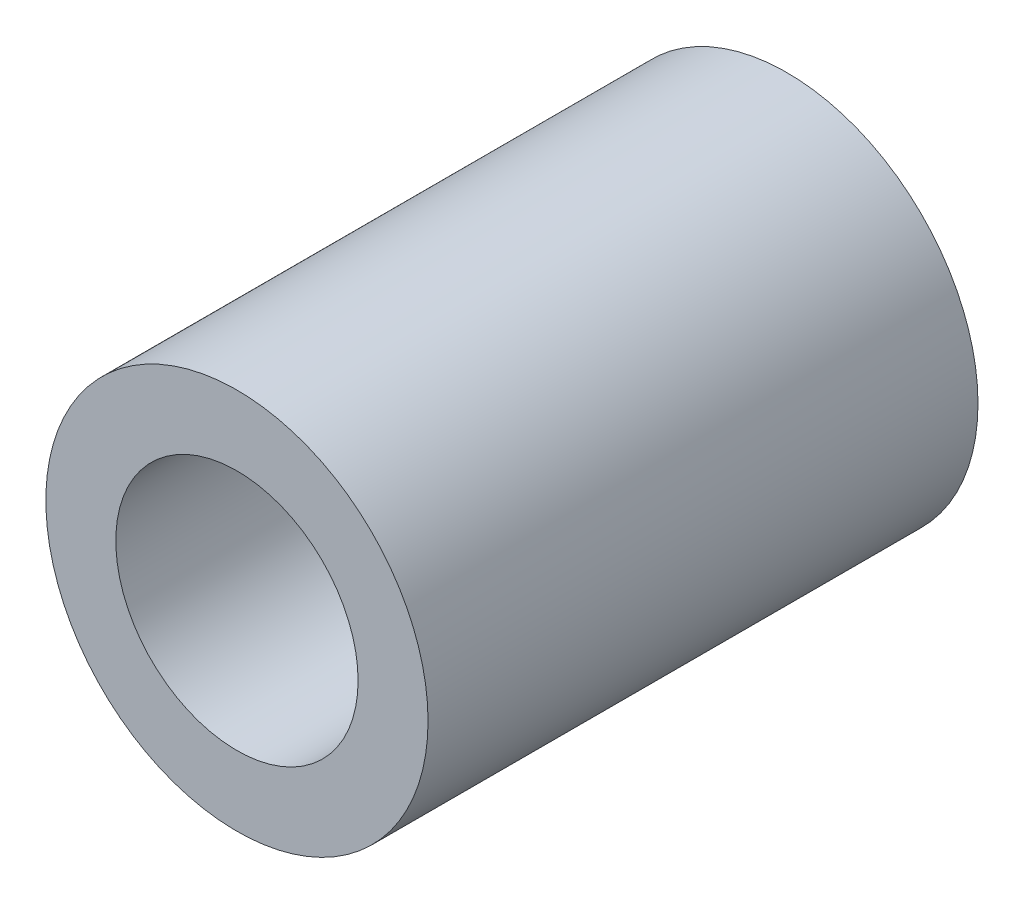
ISO-10303-21;
HEADER;
FILE_DESCRIPTION(('STEP AP214'),'2;1');
FILE_NAME('part.step','',(''),(''),'','','');
FILE_SCHEMA(('AUTOMOTIVE_DESIGN { 1 0 10303 214 1 1 1 1 }'));
ENDSEC;
DATA;
#1=APPLICATION_CONTEXT('core data for automotive mechanical design processes');
#2=APPLICATION_PROTOCOL_DEFINITION('international standard','automotive_design',2000,#1);
#3=PRODUCT_CONTEXT('',#1,'mechanical');
#4=PRODUCT('Part','Part','',(#3));
#5=PRODUCT_RELATED_PRODUCT_CATEGORY('part','',(#4));
#6=PRODUCT_DEFINITION_FORMATION('','',#4);
#7=PRODUCT_DEFINITION_CONTEXT('part definition',#1,'design');
#8=PRODUCT_DEFINITION('design','',#6,#7);
#9=PRODUCT_DEFINITION_SHAPE('','',#8);
#10=(LENGTH_UNIT() NAMED_UNIT(*) SI_UNIT(.MILLI.,.METRE.));
#11=(NAMED_UNIT(*) PLANE_ANGLE_UNIT() SI_UNIT($,.RADIAN.));
#12=(NAMED_UNIT(*) SI_UNIT($,.STERADIAN.) SOLID_ANGLE_UNIT());
#13=UNCERTAINTY_MEASURE_WITH_UNIT(LENGTH_MEASURE(1.E-05),#10,'distance_accuracy_value','');
#14=(GEOMETRIC_REPRESENTATION_CONTEXT(3) GLOBAL_UNCERTAINTY_ASSIGNED_CONTEXT((#13)) GLOBAL_UNIT_ASSIGNED_CONTEXT((#10,
#11,#12)) REPRESENTATION_CONTEXT('',''));
#15=CARTESIAN_POINT('',(0.,0.,0.));
#16=DIRECTION('',(0.,0.,1.));
#17=DIRECTION('',(1.,0.,0.));
#18=AXIS2_PLACEMENT_3D('',#15,#16,#17);
#19=CARTESIAN_POINT('',(0.,0.,-7.5));
#20=DIRECTION('',(0.,0.,1.));
#21=DIRECTION('',(1.,0.,0.));
#22=AXIS2_PLACEMENT_3D('',#19,#20,#21);
#23=CYLINDRICAL_SURFACE('',#22,3.96131883741086);
#24=CARTESIAN_POINT('',(0.,0.,-7.5));
#25=DIRECTION('',(0.,0.,1.));
#26=DIRECTION('',(1.,0.,0.));
#27=AXIS2_PLACEMENT_3D('',#24,#25,#26);
#28=CIRCLE('',#27,3.96131883741086);
#29=CARTESIAN_POINT('',(3.96131883741086,0.,-7.5));
#30=VERTEX_POINT('',#29);
#31=EDGE_CURVE('E11',#30,#30,#28,.T.);
#32=ORIENTED_EDGE('',*,*,#31,.T.);
#33=EDGE_LOOP('',(#32));
#34=FACE_BOUND('',#33,.T.);
#35=CARTESIAN_POINT('',(0.,0.,3.9));
#36=DIRECTION('',(0.,0.,1.));
#37=DIRECTION('',(1.,0.,0.));
#38=AXIS2_PLACEMENT_3D('',#35,#36,#37);
#39=CIRCLE('',#38,3.96131883741086);
#40=CARTESIAN_POINT('',(3.96131883741086,0.,3.9));
#41=VERTEX_POINT('',#40);
#42=EDGE_CURVE('E61',#41,#41,#39,.T.);
#43=ORIENTED_EDGE('',*,*,#42,.F.);
#44=EDGE_LOOP('',(#43));
#45=FACE_BOUND('',#44,.T.);
#46=ADVANCED_FACE('F51',(#34,#45),#23,.T.);
#47=CARTESIAN_POINT('',(0.,0.,-7.5));
#48=DIRECTION('',(0.,0.,1.));
#49=DIRECTION('',(1.,0.,0.));
#50=AXIS2_PLACEMENT_3D('',#47,#48,#49);
#51=PLANE('',#50);
#52=CARTESIAN_POINT('',(0.,0.,-7.5));
#53=DIRECTION('',(0.,0.,1.));
#54=DIRECTION('',(1.,0.,0.));
#55=AXIS2_PLACEMENT_3D('',#52,#53,#54);
#56=CIRCLE('',#55,2.51131883741086);
#57=CARTESIAN_POINT('',(2.51131883741086,0.,-7.5));
#58=VERTEX_POINT('',#57);
#59=EDGE_CURVE('E57',#58,#58,#56,.T.);
#60=ORIENTED_EDGE('',*,*,#59,.T.);
#61=EDGE_LOOP('',(#60));
#62=FACE_BOUND('',#61,.T.);
#63=ORIENTED_EDGE('',*,*,#31,.F.);
#64=EDGE_LOOP('',(#63));
#65=FACE_BOUND('',#64,.T.);
#66=ADVANCED_FACE('F80',(#62,#65),#51,.F.);
#67=CARTESIAN_POINT('',(0.,0.,-7.5));
#68=DIRECTION('',(0.,0.,1.));
#69=DIRECTION('',(1.,0.,0.));
#70=AXIS2_PLACEMENT_3D('',#67,#68,#69);
#71=CYLINDRICAL_SURFACE('',#70,2.51131883741086);
#72=ORIENTED_EDGE('',*,*,#59,.F.);
#73=EDGE_LOOP('',(#72));
#74=FACE_BOUND('',#73,.T.);
#75=CARTESIAN_POINT('',(0.,0.,3.9));
#76=DIRECTION('',(0.,0.,1.));
#77=DIRECTION('',(1.,0.,0.));
#78=AXIS2_PLACEMENT_3D('',#75,#76,#77);
#79=CIRCLE('',#78,2.51131883741086);
#80=CARTESIAN_POINT('',(2.51131883741086,0.,3.9));
#81=VERTEX_POINT('',#80);
#82=EDGE_CURVE('E65',#81,#81,#79,.T.);
#83=ORIENTED_EDGE('',*,*,#82,.T.);
#84=EDGE_LOOP('',(#83));
#85=FACE_BOUND('',#84,.T.);
#86=ADVANCED_FACE('F71',(#74,#85),#71,.F.);
#87=CARTESIAN_POINT('',(0.,0.,3.9));
#88=DIRECTION('',(0.,0.,1.));
#89=DIRECTION('',(1.,0.,0.));
#90=AXIS2_PLACEMENT_3D('',#87,#88,#89);
#91=PLANE('',#90);
#92=ORIENTED_EDGE('',*,*,#42,.T.);
#93=EDGE_LOOP('',(#92));
#94=FACE_BOUND('',#93,.T.);
#95=ORIENTED_EDGE('',*,*,#82,.F.);
#96=EDGE_LOOP('',(#95));
#97=FACE_BOUND('',#96,.T.);
#98=ADVANCED_FACE('F73',(#94,#97),#91,.T.);
#99=CLOSED_SHELL('',(#46,#66,#86,#98));
#100=MANIFOLD_SOLID_BREP('B2',#99);
#101=ADVANCED_BREP_SHAPE_REPRESENTATION('',(#18,#100),#14);
#102=SHAPE_DEFINITION_REPRESENTATION(#9,#101);
ENDSEC;
END-ISO-10303-21;
